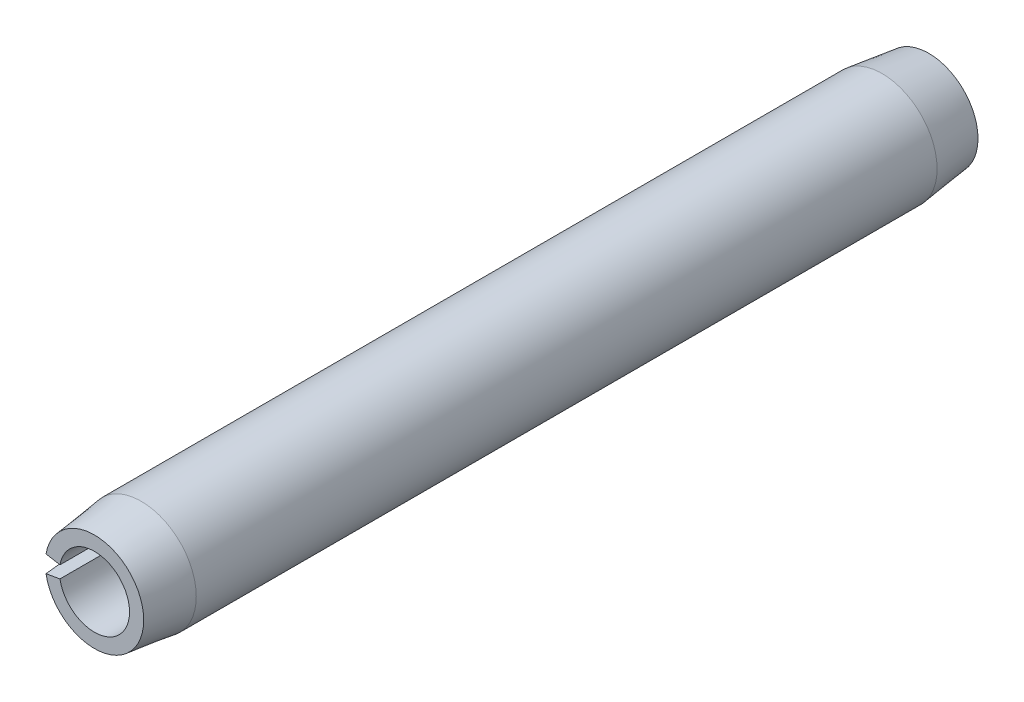
ISO-10303-21;
HEADER;
FILE_DESCRIPTION(('STEP AP214'),'2;1');
FILE_NAME('part.step','',(''),(''),'','','');
FILE_SCHEMA(('AUTOMOTIVE_DESIGN { 1 0 10303 214 1 1 1 1 }'));
ENDSEC;
DATA;
#1=APPLICATION_CONTEXT('core data for automotive mechanical design processes');
#2=APPLICATION_PROTOCOL_DEFINITION('international standard','automotive_design',2000,#1);
#3=PRODUCT_CONTEXT('',#1,'mechanical');
#4=PRODUCT('Part','Part','',(#3));
#5=PRODUCT_RELATED_PRODUCT_CATEGORY('part','',(#4));
#6=PRODUCT_DEFINITION_FORMATION('','',#4);
#7=PRODUCT_DEFINITION_CONTEXT('part definition',#1,'design');
#8=PRODUCT_DEFINITION('design','',#6,#7);
#9=PRODUCT_DEFINITION_SHAPE('','',#8);
#10=(LENGTH_UNIT() NAMED_UNIT(*) SI_UNIT(.MILLI.,.METRE.));
#11=(NAMED_UNIT(*) PLANE_ANGLE_UNIT() SI_UNIT($,.RADIAN.));
#12=(NAMED_UNIT(*) SI_UNIT($,.STERADIAN.) SOLID_ANGLE_UNIT());
#13=UNCERTAINTY_MEASURE_WITH_UNIT(LENGTH_MEASURE(1.E-05),#10,'distance_accuracy_value','');
#14=(GEOMETRIC_REPRESENTATION_CONTEXT(3) GLOBAL_UNCERTAINTY_ASSIGNED_CONTEXT((#13)) GLOBAL_UNIT_ASSIGNED_CONTEXT((#10,
#11,#12)) REPRESENTATION_CONTEXT('',''));
#15=CARTESIAN_POINT('',(0.,0.,0.));
#16=DIRECTION('',(0.,0.,1.));
#17=DIRECTION('',(1.,0.,0.));
#18=AXIS2_PLACEMENT_3D('',#15,#16,#17);
#19=CARTESIAN_POINT('',(0.,0.,6.35));
#20=DIRECTION('',(0.,0.,-1.));
#21=DIRECTION('',(-1.,0.,0.));
#22=AXIS2_PLACEMENT_3D('',#19,#20,#21);
#23=CYLINDRICAL_SURFACE('',#22,0.5334);
#24=CARTESIAN_POINT('',(0.,0.,-6.35));
#25=DIRECTION('',(0.,0.,-1.));
#26=DIRECTION('',(1.,0.,0.));
#27=AXIS2_PLACEMENT_3D('',#24,#25,#26);
#28=CIRCLE('',#27,0.5334);
#29=CARTESIAN_POINT('',(-0.525296455456712,0.0926239379675389,-6.35));
#30=VERTEX_POINT('',#29);
#31=CARTESIAN_POINT('',(-0.525296455456712,-0.0926239379675389,-6.35));
#32=VERTEX_POINT('',#31);
#33=EDGE_CURVE('E118',#30,#32,#28,.T.);
#34=ORIENTED_EDGE('',*,*,#33,.T.);
#35=DIRECTION('',(0.,0.,-1.));
#36=VECTOR('',#35,1.);
#37=CARTESIAN_POINT('',(-0.525296455456712,-0.0926239379675389,6.35));
#38=LINE('',#37,#36);
#39=CARTESIAN_POINT('',(-0.525296455456712,-0.0926239379675389,6.35));
#40=VERTEX_POINT('',#39);
#41=EDGE_CURVE('E11',#40,#32,#38,.T.);
#42=ORIENTED_EDGE('',*,*,#41,.F.);
#43=CARTESIAN_POINT('',(0.,0.,6.35));
#44=DIRECTION('',(0.,0.,-1.));
#45=DIRECTION('',(1.,0.,0.));
#46=AXIS2_PLACEMENT_3D('',#43,#44,#45);
#47=CIRCLE('',#46,0.5334);
#48=CARTESIAN_POINT('',(-0.525296455456712,0.0926239379675389,6.35));
#49=VERTEX_POINT('',#48);
#50=EDGE_CURVE('E114',#49,#40,#47,.T.);
#51=ORIENTED_EDGE('',*,*,#50,.F.);
#52=DIRECTION('',(0.,0.,-1.));
#53=VECTOR('',#52,1.);
#54=CARTESIAN_POINT('',(-0.525296455456712,0.0926239379675389,6.35));
#55=LINE('',#54,#53);
#56=EDGE_CURVE('E107',#49,#30,#55,.T.);
#57=ORIENTED_EDGE('',*,*,#56,.T.);
#58=EDGE_LOOP('',(#34,#42,#51,#57));
#59=FACE_BOUND('',#58,.T.);
#60=ADVANCED_FACE('F35',(#59),#23,.F.);
#61=CARTESIAN_POINT('',(-0.525296455456712,-0.0926239379675389,6.35));
#62=DIRECTION('',(0.173648177666927,-0.984807753012209,0.));
#63=DIRECTION('',(0.984807753012209,0.173648177666927,0.));
#64=AXIS2_PLACEMENT_3D('',#61,#62,#63);
#65=PLANE('',#64);
#66=DIRECTION('',(0.,0.,-1.));
#67=VECTOR('',#66,1.);
#68=CARTESIAN_POINT('',(-0.825465858574833,-0.145551902520418,6.35));
#69=LINE('',#68,#67);
#70=CARTESIAN_POINT('',(-0.825465858574835,-0.145551902520419,5.6388));
#71=VERTEX_POINT('',#70);
#72=CARTESIAN_POINT('',(-0.825465858574835,-0.145551902520419,-5.6388));
#73=VERTEX_POINT('',#72);
#74=EDGE_CURVE('E42',#71,#73,#69,.T.);
#75=ORIENTED_EDGE('',*,*,#74,.F.);
#76=DIRECTION('',(-0.122150368266264,-0.0215384056288171,-0.992277876713668));
#77=VECTOR('',#76,1.);
#78=CARTESIAN_POINT('',(0.,0.,12.3444));
#79=LINE('',#78,#77);
#80=CARTESIAN_POINT('',(-0.73791644933205,-0.130114579525829,6.35));
#81=VERTEX_POINT('',#80);
#82=EDGE_CURVE('E89',#71,#81,#79,.F.);
#83=ORIENTED_EDGE('',*,*,#82,.T.);
#84=DIRECTION('',(-0.984807753012209,-0.173648177666927,0.));
#85=VECTOR('',#84,1.);
#86=CARTESIAN_POINT('',(-0.525296455456712,-0.0926239379675389,6.35));
#87=LINE('',#86,#85);
#88=EDGE_CURVE('E122',#40,#81,#87,.T.);
#89=ORIENTED_EDGE('',*,*,#88,.F.);
#90=ORIENTED_EDGE('',*,*,#41,.T.);
#91=DIRECTION('',(-0.984807753012209,-0.173648177666927,0.));
#92=VECTOR('',#91,1.);
#93=CARTESIAN_POINT('',(-0.525296455456712,-0.0926239379675389,-6.35));
#94=LINE('',#93,#92);
#95=CARTESIAN_POINT('',(-0.73791644933205,-0.130114579525829,-6.35));
#96=VERTEX_POINT('',#95);
#97=EDGE_CURVE('E115',#32,#96,#94,.T.);
#98=ORIENTED_EDGE('',*,*,#97,.T.);
#99=DIRECTION('',(0.122150368266264,0.0215384056288171,-0.992277876713668));
#100=VECTOR('',#99,1.);
#101=CARTESIAN_POINT('',(0.,0.,-12.3444));
#102=LINE('',#101,#100);
#103=EDGE_CURVE('E57',#96,#73,#102,.F.);
#104=ORIENTED_EDGE('',*,*,#103,.T.);
#105=EDGE_LOOP('',(#75,#83,#89,#90,#98,#104));
#106=FACE_BOUND('',#105,.T.);
#107=ADVANCED_FACE('F136',(#106),#65,.F.);
#108=CARTESIAN_POINT('',(0.,0.,6.35));
#109=DIRECTION('',(0.,0.,-1.));
#110=DIRECTION('',(-1.,0.,0.));
#111=AXIS2_PLACEMENT_3D('',#108,#109,#110);
#112=CYLINDRICAL_SURFACE('',#111,0.8382);
#113=DIRECTION('',(0.,0.,-1.));
#114=VECTOR('',#113,1.);
#115=CARTESIAN_POINT('',(-0.825465858574833,0.145551902520418,6.35));
#116=LINE('',#115,#114);
#117=CARTESIAN_POINT('',(-0.825465858574835,0.145551902520419,5.6388));
#118=VERTEX_POINT('',#117);
#119=CARTESIAN_POINT('',(-0.825465858574835,0.145551902520419,-5.6388));
#120=VERTEX_POINT('',#119);
#121=EDGE_CURVE('E99',#118,#120,#116,.T.);
#122=ORIENTED_EDGE('',*,*,#121,.F.);
#123=CARTESIAN_POINT('',(0.,0.,5.6388));
#124=DIRECTION('',(0.,0.,-1.));
#125=DIRECTION('',(-1.,0.,0.));
#126=AXIS2_PLACEMENT_3D('',#123,#124,#125);
#127=CIRCLE('',#126,0.838200000000002);
#128=EDGE_CURVE('E86',#118,#71,#127,.T.);
#129=ORIENTED_EDGE('',*,*,#128,.T.);
#130=ORIENTED_EDGE('',*,*,#74,.T.);
#131=CARTESIAN_POINT('',(0.,0.,-5.6388));
#132=DIRECTION('',(0.,0.,-1.));
#133=DIRECTION('',(-1.,0.,0.));
#134=AXIS2_PLACEMENT_3D('',#131,#132,#133);
#135=CIRCLE('',#134,0.838200000000002);
#136=EDGE_CURVE('E106',#120,#73,#135,.T.);
#137=ORIENTED_EDGE('',*,*,#136,.F.);
#138=EDGE_LOOP('',(#122,#129,#130,#137));
#139=FACE_BOUND('',#138,.T.);
#140=ADVANCED_FACE('F105',(#139),#112,.T.);
#141=CARTESIAN_POINT('',(-0.825465858574833,0.145551902520418,6.35));
#142=DIRECTION('',(0.173648177666927,0.984807753012209,0.));
#143=DIRECTION('',(-0.984807753012209,0.173648177666927,0.));
#144=AXIS2_PLACEMENT_3D('',#141,#142,#143);
#145=PLANE('',#144);
#146=DIRECTION('',(0.984807753012209,-0.173648177666927,0.));
#147=VECTOR('',#146,1.);
#148=CARTESIAN_POINT('',(-0.825465858574833,0.145551902520418,6.35));
#149=LINE('',#148,#147);
#150=CARTESIAN_POINT('',(-0.737916449332049,0.130114579525829,6.35));
#151=VERTEX_POINT('',#150);
#152=EDGE_CURVE('E102',#151,#49,#149,.T.);
#153=ORIENTED_EDGE('',*,*,#152,.F.);
#154=DIRECTION('',(0.122150368266264,-0.0215384056288171,0.992277876713668));
#155=VECTOR('',#154,1.);
#156=CARTESIAN_POINT('',(0.,0.,12.3444));
#157=LINE('',#156,#155);
#158=EDGE_CURVE('E49',#151,#118,#157,.F.);
#159=ORIENTED_EDGE('',*,*,#158,.T.);
#160=ORIENTED_EDGE('',*,*,#121,.T.);
#161=DIRECTION('',(-0.122150368266264,0.0215384056288171,0.992277876713668));
#162=VECTOR('',#161,1.);
#163=CARTESIAN_POINT('',(0.,0.,-12.3444));
#164=LINE('',#163,#162);
#165=CARTESIAN_POINT('',(-0.737916449332049,0.130114579525829,-6.35));
#166=VERTEX_POINT('',#165);
#167=EDGE_CURVE('E128',#120,#166,#164,.F.);
#168=ORIENTED_EDGE('',*,*,#167,.T.);
#169=DIRECTION('',(0.984807753012209,-0.173648177666927,0.));
#170=VECTOR('',#169,1.);
#171=CARTESIAN_POINT('',(-0.825465858574833,0.145551902520418,-6.35));
#172=LINE('',#171,#170);
#173=EDGE_CURVE('E112',#166,#30,#172,.T.);
#174=ORIENTED_EDGE('',*,*,#173,.T.);
#175=ORIENTED_EDGE('',*,*,#56,.F.);
#176=EDGE_LOOP('',(#153,#159,#160,#168,#174,#175));
#177=FACE_BOUND('',#176,.T.);
#178=ADVANCED_FACE('F97',(#177),#145,.F.);
#179=CARTESIAN_POINT('',(0.,0.,6.35));
#180=DIRECTION('',(0.,0.,1.));
#181=DIRECTION('',(1.,0.,0.));
#182=AXIS2_PLACEMENT_3D('',#179,#180,#181);
#183=PLANE('',#182);
#184=CARTESIAN_POINT('',(0.,0.,6.35));
#185=DIRECTION('',(0.,0.,-1.));
#186=DIRECTION('',(-1.,0.,0.));
#187=AXIS2_PLACEMENT_3D('',#184,#185,#186);
#188=CIRCLE('',#187,0.749300000000002);
#189=EDGE_CURVE('E93',#151,#81,#188,.T.);
#190=ORIENTED_EDGE('',*,*,#189,.F.);
#191=ORIENTED_EDGE('',*,*,#152,.T.);
#192=ORIENTED_EDGE('',*,*,#50,.T.);
#193=ORIENTED_EDGE('',*,*,#88,.T.);
#194=EDGE_LOOP('',(#190,#191,#192,#193));
#195=FACE_BOUND('',#194,.T.);
#196=ADVANCED_FACE('F137',(#195),#183,.T.);
#197=CARTESIAN_POINT('',(0.,0.,-6.35));
#198=DIRECTION('',(0.,0.,1.));
#199=DIRECTION('',(1.,0.,0.));
#200=AXIS2_PLACEMENT_3D('',#197,#198,#199);
#201=PLANE('',#200);
#202=ORIENTED_EDGE('',*,*,#173,.F.);
#203=CARTESIAN_POINT('',(0.,0.,-6.35));
#204=DIRECTION('',(0.,0.,-1.));
#205=DIRECTION('',(-1.,0.,0.));
#206=AXIS2_PLACEMENT_3D('',#203,#204,#205);
#207=CIRCLE('',#206,0.749300000000002);
#208=EDGE_CURVE('E130',#166,#96,#207,.T.);
#209=ORIENTED_EDGE('',*,*,#208,.T.);
#210=ORIENTED_EDGE('',*,*,#97,.F.);
#211=ORIENTED_EDGE('',*,*,#33,.F.);
#212=EDGE_LOOP('',(#202,#209,#210,#211));
#213=FACE_BOUND('',#212,.T.);
#214=ADVANCED_FACE('F144',(#213),#201,.F.);
#215=CARTESIAN_POINT('',(0.,0.,-5.6388));
#216=DIRECTION('',(0.,0.,1.));
#217=DIRECTION('',(1.,0.,0.));
#218=AXIS2_PLACEMENT_3D('',#215,#216,#217);
#219=CONICAL_SURFACE('',#218,0.838200000000002,0.124354994546762);
#220=ORIENTED_EDGE('',*,*,#208,.F.);
#221=ORIENTED_EDGE('',*,*,#167,.F.);
#222=ORIENTED_EDGE('',*,*,#136,.T.);
#223=ORIENTED_EDGE('',*,*,#103,.F.);
#224=EDGE_LOOP('',(#220,#221,#222,#223));
#225=FACE_BOUND('',#224,.T.);
#226=ADVANCED_FACE('F145',(#225),#219,.T.);
#227=CARTESIAN_POINT('',(0.,0.,6.35));
#228=DIRECTION('',(0.,0.,-1.));
#229=DIRECTION('',(-1.,0.,0.));
#230=AXIS2_PLACEMENT_3D('',#227,#228,#229);
#231=CONICAL_SURFACE('',#230,0.749300000000002,0.124354994546762);
#232=ORIENTED_EDGE('',*,*,#128,.F.);
#233=ORIENTED_EDGE('',*,*,#158,.F.);
#234=ORIENTED_EDGE('',*,*,#189,.T.);
#235=ORIENTED_EDGE('',*,*,#82,.F.);
#236=EDGE_LOOP('',(#232,#233,#234,#235));
#237=FACE_BOUND('',#236,.T.);
#238=ADVANCED_FACE('F87',(#237),#231,.T.);
#239=CLOSED_SHELL('',(#60,#107,#140,#178,#196,#214,#226,#238));
#240=MANIFOLD_SOLID_BREP('B2',#239);
#241=ADVANCED_BREP_SHAPE_REPRESENTATION('',(#18,#240),#14);
#242=SHAPE_DEFINITION_REPRESENTATION(#9,#241);
ENDSEC;
END-ISO-10303-21;
